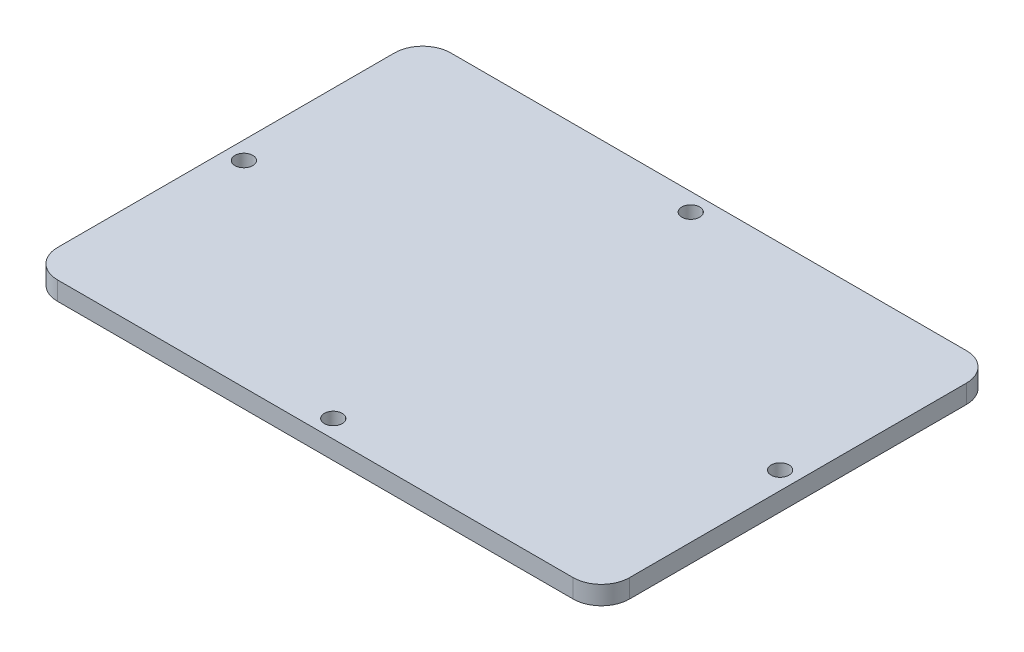
ISO-10303-21;
HEADER;
FILE_DESCRIPTION(('STEP AP214'),'2;1');
FILE_NAME('part.step','',(''),(''),'','','');
FILE_SCHEMA(('AUTOMOTIVE_DESIGN { 1 0 10303 214 1 1 1 1 }'));
ENDSEC;
DATA;
#1=APPLICATION_CONTEXT('core data for automotive mechanical design processes');
#2=APPLICATION_PROTOCOL_DEFINITION('international standard','automotive_design',2000,#1);
#3=PRODUCT_CONTEXT('',#1,'mechanical');
#4=PRODUCT('Part','Part','',(#3));
#5=PRODUCT_RELATED_PRODUCT_CATEGORY('part','',(#4));
#6=PRODUCT_DEFINITION_FORMATION('','',#4);
#7=PRODUCT_DEFINITION_CONTEXT('part definition',#1,'design');
#8=PRODUCT_DEFINITION('design','',#6,#7);
#9=PRODUCT_DEFINITION_SHAPE('','',#8);
#10=(LENGTH_UNIT() NAMED_UNIT(*) SI_UNIT(.MILLI.,.METRE.));
#11=(NAMED_UNIT(*) PLANE_ANGLE_UNIT() SI_UNIT($,.RADIAN.));
#12=(NAMED_UNIT(*) SI_UNIT($,.STERADIAN.) SOLID_ANGLE_UNIT());
#13=UNCERTAINTY_MEASURE_WITH_UNIT(LENGTH_MEASURE(1.E-05),#10,'distance_accuracy_value','');
#14=(GEOMETRIC_REPRESENTATION_CONTEXT(3) GLOBAL_UNCERTAINTY_ASSIGNED_CONTEXT((#13)) GLOBAL_UNIT_ASSIGNED_CONTEXT((#10,
#11,#12)) REPRESENTATION_CONTEXT('',''));
#15=CARTESIAN_POINT('',(0.,0.,0.));
#16=DIRECTION('',(0.,0.,1.));
#17=DIRECTION('',(1.,0.,0.));
#18=AXIS2_PLACEMENT_3D('',#15,#16,#17);
#19=CARTESIAN_POINT('',(50.8,3.302,34.925));
#20=DIRECTION('',(-1.,0.,0.));
#21=DIRECTION('',(0.,0.,1.));
#22=AXIS2_PLACEMENT_3D('',#19,#20,#21);
#23=PLANE('',#22);
#24=DIRECTION('',(0.,0.,-1.));
#25=VECTOR('',#24,1.);
#26=CARTESIAN_POINT('',(50.8,0.,34.925));
#27=LINE('',#26,#25);
#28=CARTESIAN_POINT('',(50.8,0.,29.925));
#29=VERTEX_POINT('',#28);
#30=CARTESIAN_POINT('',(50.8,0.,-29.925));
#31=VERTEX_POINT('',#30);
#32=EDGE_CURVE('E128',#29,#31,#27,.T.);
#33=ORIENTED_EDGE('',*,*,#32,.T.);
#34=DIRECTION('',(0.,-1.,0.));
#35=VECTOR('',#34,1.);
#36=CARTESIAN_POINT('',(50.8,3.302,-29.925));
#37=LINE('',#36,#35);
#38=CARTESIAN_POINT('',(50.8,3.302,-29.925));
#39=VERTEX_POINT('',#38);
#40=EDGE_CURVE('E106',#31,#39,#37,.F.);
#41=ORIENTED_EDGE('',*,*,#40,.T.);
#42=DIRECTION('',(0.,0.,-1.));
#43=VECTOR('',#42,1.);
#44=CARTESIAN_POINT('',(50.8,3.302,34.925));
#45=LINE('',#44,#43);
#46=CARTESIAN_POINT('',(50.8,3.302,29.925));
#47=VERTEX_POINT('',#46);
#48=EDGE_CURVE('E138',#47,#39,#45,.T.);
#49=ORIENTED_EDGE('',*,*,#48,.F.);
#50=DIRECTION('',(0.,-1.,0.));
#51=VECTOR('',#50,1.);
#52=CARTESIAN_POINT('',(50.8,3.302,29.925));
#53=LINE('',#52,#51);
#54=EDGE_CURVE('E111',#47,#29,#53,.T.);
#55=ORIENTED_EDGE('',*,*,#54,.T.);
#56=EDGE_LOOP('',(#33,#41,#49,#55));
#57=FACE_BOUND('',#56,.T.);
#58=ADVANCED_FACE('F35',(#57),#23,.F.);
#59=CARTESIAN_POINT('',(-50.8,3.302,-34.925));
#60=DIRECTION('',(0.,0.,1.));
#61=DIRECTION('',(1.,0.,0.));
#62=AXIS2_PLACEMENT_3D('',#59,#60,#61);
#63=PLANE('',#62);
#64=DIRECTION('',(-1.,0.,0.));
#65=VECTOR('',#64,1.);
#66=CARTESIAN_POINT('',(-50.8,3.302,-34.925));
#67=LINE('',#66,#65);
#68=CARTESIAN_POINT('',(45.8,3.302,-34.925));
#69=VERTEX_POINT('',#68);
#70=CARTESIAN_POINT('',(-45.8,3.302,-34.925));
#71=VERTEX_POINT('',#70);
#72=EDGE_CURVE('E121',#69,#71,#67,.T.);
#73=ORIENTED_EDGE('',*,*,#72,.F.);
#74=DIRECTION('',(0.,-1.,0.));
#75=VECTOR('',#74,1.);
#76=CARTESIAN_POINT('',(45.8,3.302,-34.925));
#77=LINE('',#76,#75);
#78=CARTESIAN_POINT('',(45.8,0.,-34.925));
#79=VERTEX_POINT('',#78);
#80=EDGE_CURVE('E105',#69,#79,#77,.T.);
#81=ORIENTED_EDGE('',*,*,#80,.T.);
#82=DIRECTION('',(-1.,0.,0.));
#83=VECTOR('',#82,1.);
#84=CARTESIAN_POINT('',(-50.8,0.,-34.925));
#85=LINE('',#84,#83);
#86=CARTESIAN_POINT('',(-45.8,0.,-34.925));
#87=VERTEX_POINT('',#86);
#88=EDGE_CURVE('E118',#79,#87,#85,.T.);
#89=ORIENTED_EDGE('',*,*,#88,.T.);
#90=DIRECTION('',(0.,-1.,0.));
#91=VECTOR('',#90,1.);
#92=CARTESIAN_POINT('',(-45.8,3.302,-34.925));
#93=LINE('',#92,#91);
#94=EDGE_CURVE('E123',#87,#71,#93,.F.);
#95=ORIENTED_EDGE('',*,*,#94,.T.);
#96=EDGE_LOOP('',(#73,#81,#89,#95));
#97=FACE_BOUND('',#96,.T.);
#98=ADVANCED_FACE('F117',(#97),#63,.F.);
#99=CARTESIAN_POINT('',(-50.8,3.302,34.925));
#100=DIRECTION('',(1.,0.,0.));
#101=DIRECTION('',(0.,0.,-1.));
#102=AXIS2_PLACEMENT_3D('',#99,#100,#101);
#103=PLANE('',#102);
#104=DIRECTION('',(0.,0.,1.));
#105=VECTOR('',#104,1.);
#106=CARTESIAN_POINT('',(-50.8,0.,34.925));
#107=LINE('',#106,#105);
#108=CARTESIAN_POINT('',(-50.8,0.,-29.925));
#109=VERTEX_POINT('',#108);
#110=CARTESIAN_POINT('',(-50.8,0.,29.925));
#111=VERTEX_POINT('',#110);
#112=EDGE_CURVE('E127',#109,#111,#107,.T.);
#113=ORIENTED_EDGE('',*,*,#112,.T.);
#114=DIRECTION('',(0.,-1.,0.));
#115=VECTOR('',#114,1.);
#116=CARTESIAN_POINT('',(-50.8,3.302,29.925));
#117=LINE('',#116,#115);
#118=CARTESIAN_POINT('',(-50.8,3.302,29.925));
#119=VERTEX_POINT('',#118);
#120=EDGE_CURVE('E11',#111,#119,#117,.F.);
#121=ORIENTED_EDGE('',*,*,#120,.T.);
#122=DIRECTION('',(0.,0.,1.));
#123=VECTOR('',#122,1.);
#124=CARTESIAN_POINT('',(-50.8,3.302,34.925));
#125=LINE('',#124,#123);
#126=CARTESIAN_POINT('',(-50.8,3.302,-29.925));
#127=VERTEX_POINT('',#126);
#128=EDGE_CURVE('E164',#127,#119,#125,.T.);
#129=ORIENTED_EDGE('',*,*,#128,.F.);
#130=DIRECTION('',(0.,-1.,0.));
#131=VECTOR('',#130,1.);
#132=CARTESIAN_POINT('',(-50.8,3.302,-29.925));
#133=LINE('',#132,#131);
#134=EDGE_CURVE('E43',#127,#109,#133,.T.);
#135=ORIENTED_EDGE('',*,*,#134,.T.);
#136=EDGE_LOOP('',(#113,#121,#129,#135));
#137=FACE_BOUND('',#136,.T.);
#138=ADVANCED_FACE('F162',(#137),#103,.F.);
#139=CARTESIAN_POINT('',(-50.8,3.302,34.925));
#140=DIRECTION('',(0.,0.,-1.));
#141=DIRECTION('',(-1.,0.,0.));
#142=AXIS2_PLACEMENT_3D('',#139,#140,#141);
#143=PLANE('',#142);
#144=DIRECTION('',(1.,0.,0.));
#145=VECTOR('',#144,1.);
#146=CARTESIAN_POINT('',(-50.8,0.,34.925));
#147=LINE('',#146,#145);
#148=CARTESIAN_POINT('',(-45.8,0.,34.925));
#149=VERTEX_POINT('',#148);
#150=CARTESIAN_POINT('',(45.8,0.,34.925));
#151=VERTEX_POINT('',#150);
#152=EDGE_CURVE('E131',#149,#151,#147,.T.);
#153=ORIENTED_EDGE('',*,*,#152,.T.);
#154=DIRECTION('',(0.,-1.,0.));
#155=VECTOR('',#154,1.);
#156=CARTESIAN_POINT('',(45.8,3.302,34.925));
#157=LINE('',#156,#155);
#158=CARTESIAN_POINT('',(45.8,3.302,34.925));
#159=VERTEX_POINT('',#158);
#160=EDGE_CURVE('E50',#151,#159,#157,.F.);
#161=ORIENTED_EDGE('',*,*,#160,.T.);
#162=DIRECTION('',(1.,0.,0.));
#163=VECTOR('',#162,1.);
#164=CARTESIAN_POINT('',(-50.8,3.302,34.925));
#165=LINE('',#164,#163);
#166=CARTESIAN_POINT('',(-45.8,3.302,34.925));
#167=VERTEX_POINT('',#166);
#168=EDGE_CURVE('E139',#167,#159,#165,.T.);
#169=ORIENTED_EDGE('',*,*,#168,.F.);
#170=DIRECTION('',(0.,-1.,0.));
#171=VECTOR('',#170,1.);
#172=CARTESIAN_POINT('',(-45.8,3.302,34.925));
#173=LINE('',#172,#171);
#174=EDGE_CURVE('E155',#167,#149,#173,.T.);
#175=ORIENTED_EDGE('',*,*,#174,.T.);
#176=EDGE_LOOP('',(#153,#161,#169,#175));
#177=FACE_BOUND('',#176,.T.);
#178=ADVANCED_FACE('F171',(#177),#143,.F.);
#179=CARTESIAN_POINT('',(0.,3.302,0.));
#180=DIRECTION('',(0.,-1.,0.));
#181=DIRECTION('',(0.,0.,-1.));
#182=AXIS2_PLACEMENT_3D('',#179,#180,#181);
#183=PLANE('',#182);
#184=CARTESIAN_POINT('',(0.,3.302,-31.75));
#185=DIRECTION('',(0.,-1.,0.));
#186=DIRECTION('',(0.,0.,-1.));
#187=AXIS2_PLACEMENT_3D('',#184,#185,#186);
#188=CIRCLE('',#187,1.5875);
#189=CARTESIAN_POINT('',(0.,3.302,-33.3375));
#190=VERTEX_POINT('',#189);
#191=EDGE_CURVE('E133',#190,#190,#188,.T.);
#192=ORIENTED_EDGE('',*,*,#191,.T.);
#193=EDGE_LOOP('',(#192));
#194=FACE_BOUND('',#193,.T.);
#195=CARTESIAN_POINT('',(47.625,3.302,0.));
#196=DIRECTION('',(0.,-1.,0.));
#197=DIRECTION('',(0.,0.,-1.));
#198=AXIS2_PLACEMENT_3D('',#195,#196,#197);
#199=CIRCLE('',#198,1.5875);
#200=CARTESIAN_POINT('',(47.625,3.302,-1.58749999999999));
#201=VERTEX_POINT('',#200);
#202=EDGE_CURVE('E193',#201,#201,#199,.T.);
#203=ORIENTED_EDGE('',*,*,#202,.T.);
#204=EDGE_LOOP('',(#203));
#205=FACE_BOUND('',#204,.T.);
#206=CARTESIAN_POINT('',(0.,3.302,31.75));
#207=DIRECTION('',(0.,-1.,0.));
#208=DIRECTION('',(0.,0.,-1.));
#209=AXIS2_PLACEMENT_3D('',#206,#207,#208);
#210=CIRCLE('',#209,1.5875);
#211=CARTESIAN_POINT('',(0.,3.302,30.1625));
#212=VERTEX_POINT('',#211);
#213=EDGE_CURVE('E187',#212,#212,#210,.T.);
#214=ORIENTED_EDGE('',*,*,#213,.T.);
#215=EDGE_LOOP('',(#214));
#216=FACE_BOUND('',#215,.T.);
#217=CARTESIAN_POINT('',(-47.625,3.302,0.));
#218=DIRECTION('',(0.,-1.,0.));
#219=DIRECTION('',(0.,0.,-1.));
#220=AXIS2_PLACEMENT_3D('',#217,#218,#219);
#221=CIRCLE('',#220,1.5875);
#222=CARTESIAN_POINT('',(-47.625,3.302,-1.58750000000001));
#223=VERTEX_POINT('',#222);
#224=EDGE_CURVE('E181',#223,#223,#221,.T.);
#225=ORIENTED_EDGE('',*,*,#224,.T.);
#226=EDGE_LOOP('',(#225));
#227=FACE_BOUND('',#226,.T.);
#228=ORIENTED_EDGE('',*,*,#48,.T.);
#229=CARTESIAN_POINT('',(45.8,3.302,-29.925));
#230=DIRECTION('',(0.,-1.,0.));
#231=DIRECTION('',(0.,0.,-1.));
#232=AXIS2_PLACEMENT_3D('',#229,#230,#231);
#233=CIRCLE('',#232,5.);
#234=EDGE_CURVE('E153',#39,#69,#233,.F.);
#235=ORIENTED_EDGE('',*,*,#234,.T.);
#236=ORIENTED_EDGE('',*,*,#72,.T.);
#237=CARTESIAN_POINT('',(-45.8,3.302,-29.925));
#238=DIRECTION('',(0.,-1.,0.));
#239=DIRECTION('',(0.,0.,-1.));
#240=AXIS2_PLACEMENT_3D('',#237,#238,#239);
#241=CIRCLE('',#240,5.);
#242=EDGE_CURVE('E148',#71,#127,#241,.F.);
#243=ORIENTED_EDGE('',*,*,#242,.T.);
#244=ORIENTED_EDGE('',*,*,#128,.T.);
#245=CARTESIAN_POINT('',(-45.8,3.302,29.925));
#246=DIRECTION('',(0.,-1.,0.));
#247=DIRECTION('',(0.,0.,-1.));
#248=AXIS2_PLACEMENT_3D('',#245,#246,#247);
#249=CIRCLE('',#248,5.);
#250=EDGE_CURVE('E57',#119,#167,#249,.F.);
#251=ORIENTED_EDGE('',*,*,#250,.T.);
#252=ORIENTED_EDGE('',*,*,#168,.T.);
#253=CARTESIAN_POINT('',(45.8,3.302,29.925));
#254=DIRECTION('',(0.,-1.,0.));
#255=DIRECTION('',(0.,0.,-1.));
#256=AXIS2_PLACEMENT_3D('',#253,#254,#255);
#257=CIRCLE('',#256,5.);
#258=EDGE_CURVE('E151',#159,#47,#257,.F.);
#259=ORIENTED_EDGE('',*,*,#258,.T.);
#260=EDGE_LOOP('',(#228,#235,#236,#243,#244,#251,#252,#259));
#261=FACE_BOUND('',#260,.T.);
#262=ADVANCED_FACE('F202',(#194,#205,#216,#227,#261),#183,.F.);
#263=CARTESIAN_POINT('',(0.,0.,0.));
#264=DIRECTION('',(0.,-1.,0.));
#265=DIRECTION('',(0.,0.,-1.));
#266=AXIS2_PLACEMENT_3D('',#263,#264,#265);
#267=PLANE('',#266);
#268=CARTESIAN_POINT('',(0.,0.,-31.75));
#269=DIRECTION('',(0.,-1.,0.));
#270=DIRECTION('',(0.,0.,-1.));
#271=AXIS2_PLACEMENT_3D('',#268,#269,#270);
#272=CIRCLE('',#271,1.5875);
#273=CARTESIAN_POINT('',(0.,0.,-33.3375));
#274=VERTEX_POINT('',#273);
#275=EDGE_CURVE('E196',#274,#274,#272,.T.);
#276=ORIENTED_EDGE('',*,*,#275,.F.);
#277=EDGE_LOOP('',(#276));
#278=FACE_BOUND('',#277,.T.);
#279=CARTESIAN_POINT('',(47.625,0.,0.));
#280=DIRECTION('',(0.,-1.,0.));
#281=DIRECTION('',(0.,0.,-1.));
#282=AXIS2_PLACEMENT_3D('',#279,#280,#281);
#283=CIRCLE('',#282,1.5875);
#284=CARTESIAN_POINT('',(47.625,0.,-1.58749999999999));
#285=VERTEX_POINT('',#284);
#286=EDGE_CURVE('E190',#285,#285,#283,.T.);
#287=ORIENTED_EDGE('',*,*,#286,.F.);
#288=EDGE_LOOP('',(#287));
#289=FACE_BOUND('',#288,.T.);
#290=CARTESIAN_POINT('',(0.,0.,31.75));
#291=DIRECTION('',(0.,-1.,0.));
#292=DIRECTION('',(0.,0.,-1.));
#293=AXIS2_PLACEMENT_3D('',#290,#291,#292);
#294=CIRCLE('',#293,1.5875);
#295=CARTESIAN_POINT('',(0.,0.,30.1625));
#296=VERTEX_POINT('',#295);
#297=EDGE_CURVE('E184',#296,#296,#294,.T.);
#298=ORIENTED_EDGE('',*,*,#297,.F.);
#299=EDGE_LOOP('',(#298));
#300=FACE_BOUND('',#299,.T.);
#301=CARTESIAN_POINT('',(-47.625,0.,0.));
#302=DIRECTION('',(0.,-1.,0.));
#303=DIRECTION('',(0.,0.,-1.));
#304=AXIS2_PLACEMENT_3D('',#301,#302,#303);
#305=CIRCLE('',#304,1.5875);
#306=CARTESIAN_POINT('',(-47.625,0.,-1.58750000000001));
#307=VERTEX_POINT('',#306);
#308=EDGE_CURVE('E178',#307,#307,#305,.T.);
#309=ORIENTED_EDGE('',*,*,#308,.F.);
#310=EDGE_LOOP('',(#309));
#311=FACE_BOUND('',#310,.T.);
#312=ORIENTED_EDGE('',*,*,#88,.F.);
#313=CARTESIAN_POINT('',(45.8,0.,-29.925));
#314=DIRECTION('',(0.,-1.,0.));
#315=DIRECTION('',(0.,0.,-1.));
#316=AXIS2_PLACEMENT_3D('',#313,#314,#315);
#317=CIRCLE('',#316,5.);
#318=EDGE_CURVE('E101',#79,#31,#317,.T.);
#319=ORIENTED_EDGE('',*,*,#318,.T.);
#320=ORIENTED_EDGE('',*,*,#32,.F.);
#321=CARTESIAN_POINT('',(45.8,0.,29.925));
#322=DIRECTION('',(0.,-1.,0.));
#323=DIRECTION('',(0.,0.,-1.));
#324=AXIS2_PLACEMENT_3D('',#321,#322,#323);
#325=CIRCLE('',#324,5.);
#326=EDGE_CURVE('E112',#29,#151,#325,.T.);
#327=ORIENTED_EDGE('',*,*,#326,.T.);
#328=ORIENTED_EDGE('',*,*,#152,.F.);
#329=CARTESIAN_POINT('',(-45.8,0.,29.925));
#330=DIRECTION('',(0.,-1.,0.));
#331=DIRECTION('',(0.,0.,-1.));
#332=AXIS2_PLACEMENT_3D('',#329,#330,#331);
#333=CIRCLE('',#332,5.);
#334=EDGE_CURVE('E142',#149,#111,#333,.T.);
#335=ORIENTED_EDGE('',*,*,#334,.T.);
#336=ORIENTED_EDGE('',*,*,#112,.F.);
#337=CARTESIAN_POINT('',(-45.8,0.,-29.925));
#338=DIRECTION('',(0.,-1.,0.));
#339=DIRECTION('',(0.,0.,-1.));
#340=AXIS2_PLACEMENT_3D('',#337,#338,#339);
#341=CIRCLE('',#340,5.);
#342=EDGE_CURVE('E122',#109,#87,#341,.T.);
#343=ORIENTED_EDGE('',*,*,#342,.T.);
#344=EDGE_LOOP('',(#312,#319,#320,#327,#328,#335,#336,#343));
#345=FACE_BOUND('',#344,.T.);
#346=ADVANCED_FACE('F125',(#278,#289,#300,#311,#345),#267,.T.);
#347=CARTESIAN_POINT('',(-47.625,3.302,0.));
#348=DIRECTION('',(0.,-1.,0.));
#349=DIRECTION('',(0.,0.,-1.));
#350=AXIS2_PLACEMENT_3D('',#347,#348,#349);
#351=CYLINDRICAL_SURFACE('',#350,1.5875);
#352=CARTESIAN_POINT('',(-47.625,3.302,-1.58750000000001));
#353=CARTESIAN_POINT('',(-47.625,3.26760416666667,-1.58750000000001));
#354=CARTESIAN_POINT('',(-47.625,3.23320833333333,-1.58750000000001));
#355=CARTESIAN_POINT('',(-47.625,3.16441666666667,-1.58750000000001));
#356=CARTESIAN_POINT('',(-47.625,3.13002083333333,-1.58750000000001));
#357=CARTESIAN_POINT('',(-47.625,3.06122916666667,-1.58750000000001));
#358=CARTESIAN_POINT('',(-47.625,3.02683333333333,-1.58750000000001));
#359=CARTESIAN_POINT('',(-47.625,2.95804166666667,-1.58750000000001));
#360=CARTESIAN_POINT('',(-47.625,2.92364583333333,-1.58750000000001));
#361=CARTESIAN_POINT('',(-47.625,2.85485416666667,-1.58750000000001));
#362=CARTESIAN_POINT('',(-47.625,2.82045833333333,-1.58750000000001));
#363=CARTESIAN_POINT('',(-47.625,2.75166666666667,-1.58750000000001));
#364=CARTESIAN_POINT('',(-47.625,2.71727083333333,-1.58750000000001));
#365=CARTESIAN_POINT('',(-47.625,2.64847916666667,-1.58750000000001));
#366=CARTESIAN_POINT('',(-47.625,2.61408333333333,-1.58750000000001));
#367=CARTESIAN_POINT('',(-47.625,2.54529166666667,-1.58750000000001));
#368=CARTESIAN_POINT('',(-47.625,2.51089583333333,-1.58750000000001));
#369=CARTESIAN_POINT('',(-47.625,2.44210416666667,-1.58750000000001));
#370=CARTESIAN_POINT('',(-47.625,2.40770833333333,-1.58750000000001));
#371=CARTESIAN_POINT('',(-47.625,2.33891666666667,-1.58750000000001));
#372=CARTESIAN_POINT('',(-47.625,2.30452083333333,-1.58750000000001));
#373=CARTESIAN_POINT('',(-47.625,2.23572916666667,-1.58750000000001));
#374=CARTESIAN_POINT('',(-47.625,2.20133333333333,-1.58750000000001));
#375=CARTESIAN_POINT('',(-47.625,2.13254166666667,-1.58750000000001));
#376=CARTESIAN_POINT('',(-47.625,2.09814583333333,-1.58750000000001));
#377=CARTESIAN_POINT('',(-47.625,2.02935416666667,-1.58750000000001));
#378=CARTESIAN_POINT('',(-47.625,1.99495833333333,-1.58750000000001));
#379=CARTESIAN_POINT('',(-47.625,1.92616666666667,-1.58750000000001));
#380=CARTESIAN_POINT('',(-47.625,1.89177083333333,-1.58750000000001));
#381=CARTESIAN_POINT('',(-47.625,1.82297916666667,-1.58750000000001));
#382=CARTESIAN_POINT('',(-47.625,1.78858333333333,-1.58750000000001));
#383=CARTESIAN_POINT('',(-47.625,1.71979166666667,-1.58750000000001));
#384=CARTESIAN_POINT('',(-47.625,1.68539583333333,-1.58750000000001));
#385=CARTESIAN_POINT('',(-47.625,1.61660416666667,-1.58750000000001));
#386=CARTESIAN_POINT('',(-47.625,1.58220833333333,-1.58750000000001));
#387=CARTESIAN_POINT('',(-47.625,1.51341666666667,-1.58750000000001));
#388=CARTESIAN_POINT('',(-47.625,1.47902083333333,-1.58750000000001));
#389=CARTESIAN_POINT('',(-47.625,1.41022916666667,-1.58750000000001));
#390=CARTESIAN_POINT('',(-47.625,1.37583333333333,-1.58750000000001));
#391=CARTESIAN_POINT('',(-47.625,1.30704166666667,-1.58750000000001));
#392=CARTESIAN_POINT('',(-47.625,1.27264583333333,-1.58750000000001));
#393=CARTESIAN_POINT('',(-47.625,1.20385416666667,-1.58750000000001));
#394=CARTESIAN_POINT('',(-47.625,1.16945833333333,-1.58750000000001));
#395=CARTESIAN_POINT('',(-47.625,1.10066666666667,-1.58750000000001));
#396=CARTESIAN_POINT('',(-47.625,1.06627083333333,-1.58750000000001));
#397=CARTESIAN_POINT('',(-47.625,0.997479166666667,-1.58750000000001));
#398=CARTESIAN_POINT('',(-47.625,0.963083333333334,-1.58750000000001));
#399=CARTESIAN_POINT('',(-47.625,0.894291666666667,-1.58750000000001));
#400=CARTESIAN_POINT('',(-47.625,0.859895833333333,-1.58750000000001));
#401=CARTESIAN_POINT('',(-47.625,0.791104166666666,-1.58750000000001));
#402=CARTESIAN_POINT('',(-47.625,0.756708333333333,-1.58750000000001));
#403=CARTESIAN_POINT('',(-47.625,0.687916666666667,-1.58750000000001));
#404=CARTESIAN_POINT('',(-47.625,0.653520833333333,-1.58750000000001));
#405=CARTESIAN_POINT('',(-47.625,0.584729166666667,-1.58750000000001));
#406=CARTESIAN_POINT('',(-47.625,0.550333333333333,-1.58750000000001));
#407=CARTESIAN_POINT('',(-47.625,0.481541666666667,-1.58750000000001));
#408=CARTESIAN_POINT('',(-47.625,0.447145833333333,-1.58750000000001));
#409=CARTESIAN_POINT('',(-47.625,0.378354166666667,-1.58750000000001));
#410=CARTESIAN_POINT('',(-47.625,0.343958333333333,-1.58750000000001));
#411=CARTESIAN_POINT('',(-47.625,0.275166666666667,-1.58750000000001));
#412=CARTESIAN_POINT('',(-47.625,0.240770833333333,-1.58750000000001));
#413=CARTESIAN_POINT('',(-47.625,0.171979166666667,-1.58750000000001));
#414=CARTESIAN_POINT('',(-47.625,0.137583333333333,-1.58750000000001));
#415=CARTESIAN_POINT('',(-47.625,0.0687916666666666,-1.58750000000001));
#416=CARTESIAN_POINT('',(-47.625,0.0343958333333333,-1.58750000000001));
#417=CARTESIAN_POINT('',(-47.625,0.,-1.58750000000001));
#418=B_SPLINE_CURVE_WITH_KNOTS('',3,(#352,#353,#354,#355,#356,#357,#358,#359,#360,#361,#362,
#363,#364,#365,#366,#367,#368,#369,#370,#371,#372,#373,#374,#375,#376,#377,#378,#379,#380,#381,
#382,#383,#384,#385,#386,#387,#388,#389,#390,#391,#392,#393,#394,#395,#396,#397,#398,#399,#400,
#401,#402,#403,#404,#405,#406,#407,#408,#409,#410,#411,#412,#413,#414,#415,#416,#417),
.UNSPECIFIED.,.F.,.F.,(4,2,2,2,2,2,2,2,2,2,2,2,2,2,2,2,2,2,2,2,2,2,2,2,2,2,2,2,2,2,2,2,4),(0.,
0.1031875,0.206375,0.3095625,0.41275,0.515937499999999,0.619125,0.7223125,0.8255,0.9286875,
1.031875,1.1350625,1.23825,1.3414375,1.444625,1.5478125,1.651,1.7541875,1.857375,1.9605625,
2.06375,2.1669375,2.270125,2.3733125,2.4765,2.5796875,2.682875,2.7860625,2.88925,2.9924375,
3.095625,3.1988125,3.302),.UNSPECIFIED.);
#419=EDGE_CURVE('BSEAM214',#223,#307,#418,.T.);
#420=ORIENTED_EDGE('',*,*,#224,.F.);
#421=ORIENTED_EDGE('',*,*,#308,.T.);
#422=ORIENTED_EDGE('',*,*,#419,.T.);
#423=ORIENTED_EDGE('',*,*,#419,.F.);
#424=EDGE_LOOP('',(#420,#422,#421,#423));
#425=FACE_BOUND('',#424,.T.);
#426=ADVANCED_FACE('F214',(#425),#351,.F.);
#427=CARTESIAN_POINT('',(0.,3.302,31.75));
#428=DIRECTION('',(0.,-1.,0.));
#429=DIRECTION('',(0.,0.,-1.));
#430=AXIS2_PLACEMENT_3D('',#427,#428,#429);
#431=CYLINDRICAL_SURFACE('',#430,1.5875);
#432=CARTESIAN_POINT('',(0.,3.302,30.1625));
#433=CARTESIAN_POINT('',(0.,3.26760416666667,30.1625));
#434=CARTESIAN_POINT('',(0.,3.23320833333333,30.1625));
#435=CARTESIAN_POINT('',(0.,3.16441666666667,30.1625));
#436=CARTESIAN_POINT('',(0.,3.13002083333333,30.1625));
#437=CARTESIAN_POINT('',(0.,3.06122916666667,30.1625));
#438=CARTESIAN_POINT('',(0.,3.02683333333333,30.1625));
#439=CARTESIAN_POINT('',(0.,2.95804166666667,30.1625));
#440=CARTESIAN_POINT('',(0.,2.92364583333333,30.1625));
#441=CARTESIAN_POINT('',(0.,2.85485416666667,30.1625));
#442=CARTESIAN_POINT('',(0.,2.82045833333333,30.1625));
#443=CARTESIAN_POINT('',(0.,2.75166666666667,30.1625));
#444=CARTESIAN_POINT('',(0.,2.71727083333333,30.1625));
#445=CARTESIAN_POINT('',(0.,2.64847916666667,30.1625));
#446=CARTESIAN_POINT('',(0.,2.61408333333333,30.1625));
#447=CARTESIAN_POINT('',(0.,2.54529166666667,30.1625));
#448=CARTESIAN_POINT('',(0.,2.51089583333333,30.1625));
#449=CARTESIAN_POINT('',(0.,2.44210416666667,30.1625));
#450=CARTESIAN_POINT('',(0.,2.40770833333333,30.1625));
#451=CARTESIAN_POINT('',(0.,2.33891666666667,30.1625));
#452=CARTESIAN_POINT('',(0.,2.30452083333333,30.1625));
#453=CARTESIAN_POINT('',(0.,2.23572916666667,30.1625));
#454=CARTESIAN_POINT('',(0.,2.20133333333333,30.1625));
#455=CARTESIAN_POINT('',(0.,2.13254166666667,30.1625));
#456=CARTESIAN_POINT('',(0.,2.09814583333333,30.1625));
#457=CARTESIAN_POINT('',(0.,2.02935416666667,30.1625));
#458=CARTESIAN_POINT('',(0.,1.99495833333333,30.1625));
#459=CARTESIAN_POINT('',(0.,1.92616666666667,30.1625));
#460=CARTESIAN_POINT('',(0.,1.89177083333333,30.1625));
#461=CARTESIAN_POINT('',(0.,1.82297916666667,30.1625));
#462=CARTESIAN_POINT('',(0.,1.78858333333333,30.1625));
#463=CARTESIAN_POINT('',(0.,1.71979166666667,30.1625));
#464=CARTESIAN_POINT('',(0.,1.68539583333333,30.1625));
#465=CARTESIAN_POINT('',(0.,1.61660416666667,30.1625));
#466=CARTESIAN_POINT('',(0.,1.58220833333333,30.1625));
#467=CARTESIAN_POINT('',(0.,1.51341666666667,30.1625));
#468=CARTESIAN_POINT('',(0.,1.47902083333333,30.1625));
#469=CARTESIAN_POINT('',(0.,1.41022916666667,30.1625));
#470=CARTESIAN_POINT('',(0.,1.37583333333333,30.1625));
#471=CARTESIAN_POINT('',(0.,1.30704166666667,30.1625));
#472=CARTESIAN_POINT('',(0.,1.27264583333333,30.1625));
#473=CARTESIAN_POINT('',(0.,1.20385416666667,30.1625));
#474=CARTESIAN_POINT('',(0.,1.16945833333333,30.1625));
#475=CARTESIAN_POINT('',(0.,1.10066666666667,30.1625));
#476=CARTESIAN_POINT('',(0.,1.06627083333333,30.1625));
#477=CARTESIAN_POINT('',(0.,0.997479166666667,30.1625));
#478=CARTESIAN_POINT('',(0.,0.963083333333334,30.1625));
#479=CARTESIAN_POINT('',(0.,0.894291666666667,30.1625));
#480=CARTESIAN_POINT('',(0.,0.859895833333333,30.1625));
#481=CARTESIAN_POINT('',(0.,0.791104166666666,30.1625));
#482=CARTESIAN_POINT('',(0.,0.756708333333333,30.1625));
#483=CARTESIAN_POINT('',(0.,0.687916666666667,30.1625));
#484=CARTESIAN_POINT('',(0.,0.653520833333333,30.1625));
#485=CARTESIAN_POINT('',(0.,0.584729166666667,30.1625));
#486=CARTESIAN_POINT('',(0.,0.550333333333333,30.1625));
#487=CARTESIAN_POINT('',(0.,0.481541666666667,30.1625));
#488=CARTESIAN_POINT('',(0.,0.447145833333333,30.1625));
#489=CARTESIAN_POINT('',(0.,0.378354166666667,30.1625));
#490=CARTESIAN_POINT('',(0.,0.343958333333333,30.1625));
#491=CARTESIAN_POINT('',(0.,0.275166666666667,30.1625));
#492=CARTESIAN_POINT('',(0.,0.240770833333333,30.1625));
#493=CARTESIAN_POINT('',(0.,0.171979166666667,30.1625));
#494=CARTESIAN_POINT('',(0.,0.137583333333333,30.1625));
#495=CARTESIAN_POINT('',(0.,0.0687916666666666,30.1625));
#496=CARTESIAN_POINT('',(0.,0.0343958333333333,30.1625));
#497=CARTESIAN_POINT('',(0.,0.,30.1625));
#498=B_SPLINE_CURVE_WITH_KNOTS('',3,(#432,#433,#434,#435,#436,#437,#438,#439,#440,#441,#442,
#443,#444,#445,#446,#447,#448,#449,#450,#451,#452,#453,#454,#455,#456,#457,#458,#459,#460,#461,
#462,#463,#464,#465,#466,#467,#468,#469,#470,#471,#472,#473,#474,#475,#476,#477,#478,#479,#480,
#481,#482,#483,#484,#485,#486,#487,#488,#489,#490,#491,#492,#493,#494,#495,#496,#497),
.UNSPECIFIED.,.F.,.F.,(4,2,2,2,2,2,2,2,2,2,2,2,2,2,2,2,2,2,2,2,2,2,2,2,2,2,2,2,2,2,2,2,4),(0.,
0.1031875,0.206375,0.3095625,0.41275,0.515937499999999,0.619125,0.7223125,0.8255,0.9286875,
1.031875,1.1350625,1.23825,1.3414375,1.444625,1.5478125,1.651,1.7541875,1.857375,1.9605625,
2.06375,2.1669375,2.270125,2.3733125,2.4765,2.5796875,2.682875,2.7860625,2.88925,2.9924375,
3.095625,3.1988125,3.302),.UNSPECIFIED.);
#499=EDGE_CURVE('BSEAM223',#212,#296,#498,.T.);
#500=ORIENTED_EDGE('',*,*,#213,.F.);
#501=ORIENTED_EDGE('',*,*,#297,.T.);
#502=ORIENTED_EDGE('',*,*,#499,.T.);
#503=ORIENTED_EDGE('',*,*,#499,.F.);
#504=EDGE_LOOP('',(#500,#502,#501,#503));
#505=FACE_BOUND('',#504,.T.);
#506=ADVANCED_FACE('F223',(#505),#431,.F.);
#507=CARTESIAN_POINT('',(47.625,3.302,0.));
#508=DIRECTION('',(0.,-1.,0.));
#509=DIRECTION('',(0.,0.,-1.));
#510=AXIS2_PLACEMENT_3D('',#507,#508,#509);
#511=CYLINDRICAL_SURFACE('',#510,1.5875);
#512=CARTESIAN_POINT('',(47.625,3.302,-1.58749999999999));
#513=CARTESIAN_POINT('',(47.625,3.26760416666667,-1.58749999999999));
#514=CARTESIAN_POINT('',(47.625,3.23320833333333,-1.58749999999999));
#515=CARTESIAN_POINT('',(47.625,3.16441666666667,-1.58749999999999));
#516=CARTESIAN_POINT('',(47.625,3.13002083333333,-1.58749999999999));
#517=CARTESIAN_POINT('',(47.625,3.06122916666667,-1.58749999999999));
#518=CARTESIAN_POINT('',(47.625,3.02683333333333,-1.58749999999999));
#519=CARTESIAN_POINT('',(47.625,2.95804166666667,-1.58749999999999));
#520=CARTESIAN_POINT('',(47.625,2.92364583333333,-1.58749999999999));
#521=CARTESIAN_POINT('',(47.625,2.85485416666667,-1.58749999999999));
#522=CARTESIAN_POINT('',(47.625,2.82045833333333,-1.58749999999999));
#523=CARTESIAN_POINT('',(47.625,2.75166666666667,-1.58749999999999));
#524=CARTESIAN_POINT('',(47.625,2.71727083333333,-1.58749999999999));
#525=CARTESIAN_POINT('',(47.625,2.64847916666667,-1.58749999999999));
#526=CARTESIAN_POINT('',(47.625,2.61408333333333,-1.58749999999999));
#527=CARTESIAN_POINT('',(47.625,2.54529166666667,-1.58749999999999));
#528=CARTESIAN_POINT('',(47.625,2.51089583333333,-1.58749999999999));
#529=CARTESIAN_POINT('',(47.625,2.44210416666667,-1.58749999999999));
#530=CARTESIAN_POINT('',(47.625,2.40770833333333,-1.58749999999999));
#531=CARTESIAN_POINT('',(47.625,2.33891666666667,-1.58749999999999));
#532=CARTESIAN_POINT('',(47.625,2.30452083333333,-1.58749999999999));
#533=CARTESIAN_POINT('',(47.625,2.23572916666667,-1.58749999999999));
#534=CARTESIAN_POINT('',(47.625,2.20133333333333,-1.58749999999999));
#535=CARTESIAN_POINT('',(47.625,2.13254166666667,-1.58749999999999));
#536=CARTESIAN_POINT('',(47.625,2.09814583333333,-1.58749999999999));
#537=CARTESIAN_POINT('',(47.625,2.02935416666667,-1.58749999999999));
#538=CARTESIAN_POINT('',(47.625,1.99495833333333,-1.58749999999999));
#539=CARTESIAN_POINT('',(47.625,1.92616666666667,-1.58749999999999));
#540=CARTESIAN_POINT('',(47.625,1.89177083333333,-1.58749999999999));
#541=CARTESIAN_POINT('',(47.625,1.82297916666667,-1.58749999999999));
#542=CARTESIAN_POINT('',(47.625,1.78858333333333,-1.58749999999999));
#543=CARTESIAN_POINT('',(47.625,1.71979166666667,-1.58749999999999));
#544=CARTESIAN_POINT('',(47.625,1.68539583333333,-1.58749999999999));
#545=CARTESIAN_POINT('',(47.625,1.61660416666667,-1.58749999999999));
#546=CARTESIAN_POINT('',(47.625,1.58220833333333,-1.58749999999999));
#547=CARTESIAN_POINT('',(47.625,1.51341666666667,-1.58749999999999));
#548=CARTESIAN_POINT('',(47.625,1.47902083333333,-1.58749999999999));
#549=CARTESIAN_POINT('',(47.625,1.41022916666667,-1.58749999999999));
#550=CARTESIAN_POINT('',(47.625,1.37583333333333,-1.58749999999999));
#551=CARTESIAN_POINT('',(47.625,1.30704166666667,-1.58749999999999));
#552=CARTESIAN_POINT('',(47.625,1.27264583333333,-1.58749999999999));
#553=CARTESIAN_POINT('',(47.625,1.20385416666667,-1.58749999999999));
#554=CARTESIAN_POINT('',(47.625,1.16945833333333,-1.58749999999999));
#555=CARTESIAN_POINT('',(47.625,1.10066666666667,-1.58749999999999));
#556=CARTESIAN_POINT('',(47.625,1.06627083333333,-1.58749999999999));
#557=CARTESIAN_POINT('',(47.625,0.997479166666667,-1.58749999999999));
#558=CARTESIAN_POINT('',(47.625,0.963083333333334,-1.58749999999999));
#559=CARTESIAN_POINT('',(47.625,0.894291666666667,-1.58749999999999));
#560=CARTESIAN_POINT('',(47.625,0.859895833333333,-1.58749999999999));
#561=CARTESIAN_POINT('',(47.625,0.791104166666666,-1.58749999999999));
#562=CARTESIAN_POINT('',(47.625,0.756708333333333,-1.58749999999999));
#563=CARTESIAN_POINT('',(47.625,0.687916666666667,-1.58749999999999));
#564=CARTESIAN_POINT('',(47.625,0.653520833333333,-1.58749999999999));
#565=CARTESIAN_POINT('',(47.625,0.584729166666667,-1.58749999999999));
#566=CARTESIAN_POINT('',(47.625,0.550333333333333,-1.58749999999999));
#567=CARTESIAN_POINT('',(47.625,0.481541666666667,-1.58749999999999));
#568=CARTESIAN_POINT('',(47.625,0.447145833333333,-1.58749999999999));
#569=CARTESIAN_POINT('',(47.625,0.378354166666667,-1.58749999999999));
#570=CARTESIAN_POINT('',(47.625,0.343958333333333,-1.58749999999999));
#571=CARTESIAN_POINT('',(47.625,0.275166666666667,-1.58749999999999));
#572=CARTESIAN_POINT('',(47.625,0.240770833333333,-1.58749999999999));
#573=CARTESIAN_POINT('',(47.625,0.171979166666667,-1.58749999999999));
#574=CARTESIAN_POINT('',(47.625,0.137583333333333,-1.58749999999999));
#575=CARTESIAN_POINT('',(47.625,0.0687916666666666,-1.58749999999999));
#576=CARTESIAN_POINT('',(47.625,0.0343958333333333,-1.58749999999999));
#577=CARTESIAN_POINT('',(47.625,0.,-1.58749999999999));
#578=B_SPLINE_CURVE_WITH_KNOTS('',3,(#512,#513,#514,#515,#516,#517,#518,#519,#520,#521,#522,
#523,#524,#525,#526,#527,#528,#529,#530,#531,#532,#533,#534,#535,#536,#537,#538,#539,#540,#541,
#542,#543,#544,#545,#546,#547,#548,#549,#550,#551,#552,#553,#554,#555,#556,#557,#558,#559,#560,
#561,#562,#563,#564,#565,#566,#567,#568,#569,#570,#571,#572,#573,#574,#575,#576,#577),
.UNSPECIFIED.,.F.,.F.,(4,2,2,2,2,2,2,2,2,2,2,2,2,2,2,2,2,2,2,2,2,2,2,2,2,2,2,2,2,2,2,2,4),(0.,
0.1031875,0.206375,0.3095625,0.41275,0.515937499999999,0.619125,0.7223125,0.8255,0.9286875,
1.031875,1.1350625,1.23825,1.3414375,1.444625,1.5478125,1.651,1.7541875,1.857375,1.9605625,
2.06375,2.1669375,2.270125,2.3733125,2.4765,2.5796875,2.682875,2.7860625,2.88925,2.9924375,
3.095625,3.1988125,3.302),.UNSPECIFIED.);
#579=EDGE_CURVE('BSEAM208',#201,#285,#578,.T.);
#580=ORIENTED_EDGE('',*,*,#202,.F.);
#581=ORIENTED_EDGE('',*,*,#286,.T.);
#582=ORIENTED_EDGE('',*,*,#579,.T.);
#583=ORIENTED_EDGE('',*,*,#579,.F.);
#584=EDGE_LOOP('',(#580,#582,#581,#583));
#585=FACE_BOUND('',#584,.T.);
#586=ADVANCED_FACE('F208',(#585),#511,.F.);
#587=CARTESIAN_POINT('',(0.,3.302,-31.75));
#588=DIRECTION('',(0.,-1.,0.));
#589=DIRECTION('',(0.,0.,-1.));
#590=AXIS2_PLACEMENT_3D('',#587,#588,#589);
#591=CYLINDRICAL_SURFACE('',#590,1.5875);
#592=CARTESIAN_POINT('',(0.,3.302,-33.3375));
#593=CARTESIAN_POINT('',(0.,3.26760416666667,-33.3375));
#594=CARTESIAN_POINT('',(0.,3.23320833333333,-33.3375));
#595=CARTESIAN_POINT('',(0.,3.16441666666667,-33.3375));
#596=CARTESIAN_POINT('',(0.,3.13002083333333,-33.3375));
#597=CARTESIAN_POINT('',(0.,3.06122916666667,-33.3375));
#598=CARTESIAN_POINT('',(0.,3.02683333333333,-33.3375));
#599=CARTESIAN_POINT('',(0.,2.95804166666667,-33.3375));
#600=CARTESIAN_POINT('',(0.,2.92364583333333,-33.3375));
#601=CARTESIAN_POINT('',(0.,2.85485416666667,-33.3375));
#602=CARTESIAN_POINT('',(0.,2.82045833333333,-33.3375));
#603=CARTESIAN_POINT('',(0.,2.75166666666667,-33.3375));
#604=CARTESIAN_POINT('',(0.,2.71727083333333,-33.3375));
#605=CARTESIAN_POINT('',(0.,2.64847916666667,-33.3375));
#606=CARTESIAN_POINT('',(0.,2.61408333333333,-33.3375));
#607=CARTESIAN_POINT('',(0.,2.54529166666667,-33.3375));
#608=CARTESIAN_POINT('',(0.,2.51089583333333,-33.3375));
#609=CARTESIAN_POINT('',(0.,2.44210416666667,-33.3375));
#610=CARTESIAN_POINT('',(0.,2.40770833333333,-33.3375));
#611=CARTESIAN_POINT('',(0.,2.33891666666667,-33.3375));
#612=CARTESIAN_POINT('',(0.,2.30452083333333,-33.3375));
#613=CARTESIAN_POINT('',(0.,2.23572916666667,-33.3375));
#614=CARTESIAN_POINT('',(0.,2.20133333333333,-33.3375));
#615=CARTESIAN_POINT('',(0.,2.13254166666667,-33.3375));
#616=CARTESIAN_POINT('',(0.,2.09814583333333,-33.3375));
#617=CARTESIAN_POINT('',(0.,2.02935416666667,-33.3375));
#618=CARTESIAN_POINT('',(0.,1.99495833333333,-33.3375));
#619=CARTESIAN_POINT('',(0.,1.92616666666667,-33.3375));
#620=CARTESIAN_POINT('',(0.,1.89177083333333,-33.3375));
#621=CARTESIAN_POINT('',(0.,1.82297916666667,-33.3375));
#622=CARTESIAN_POINT('',(0.,1.78858333333333,-33.3375));
#623=CARTESIAN_POINT('',(0.,1.71979166666667,-33.3375));
#624=CARTESIAN_POINT('',(0.,1.68539583333333,-33.3375));
#625=CARTESIAN_POINT('',(0.,1.61660416666667,-33.3375));
#626=CARTESIAN_POINT('',(0.,1.58220833333333,-33.3375));
#627=CARTESIAN_POINT('',(0.,1.51341666666667,-33.3375));
#628=CARTESIAN_POINT('',(0.,1.47902083333333,-33.3375));
#629=CARTESIAN_POINT('',(0.,1.41022916666667,-33.3375));
#630=CARTESIAN_POINT('',(0.,1.37583333333333,-33.3375));
#631=CARTESIAN_POINT('',(0.,1.30704166666667,-33.3375));
#632=CARTESIAN_POINT('',(0.,1.27264583333333,-33.3375));
#633=CARTESIAN_POINT('',(0.,1.20385416666667,-33.3375));
#634=CARTESIAN_POINT('',(0.,1.16945833333333,-33.3375));
#635=CARTESIAN_POINT('',(0.,1.10066666666667,-33.3375));
#636=CARTESIAN_POINT('',(0.,1.06627083333333,-33.3375));
#637=CARTESIAN_POINT('',(0.,0.997479166666667,-33.3375));
#638=CARTESIAN_POINT('',(0.,0.963083333333334,-33.3375));
#639=CARTESIAN_POINT('',(0.,0.894291666666667,-33.3375));
#640=CARTESIAN_POINT('',(0.,0.859895833333333,-33.3375));
#641=CARTESIAN_POINT('',(0.,0.791104166666666,-33.3375));
#642=CARTESIAN_POINT('',(0.,0.756708333333333,-33.3375));
#643=CARTESIAN_POINT('',(0.,0.687916666666667,-33.3375));
#644=CARTESIAN_POINT('',(0.,0.653520833333333,-33.3375));
#645=CARTESIAN_POINT('',(0.,0.584729166666667,-33.3375));
#646=CARTESIAN_POINT('',(0.,0.550333333333333,-33.3375));
#647=CARTESIAN_POINT('',(0.,0.481541666666667,-33.3375));
#648=CARTESIAN_POINT('',(0.,0.447145833333333,-33.3375));
#649=CARTESIAN_POINT('',(0.,0.378354166666667,-33.3375));
#650=CARTESIAN_POINT('',(0.,0.343958333333333,-33.3375));
#651=CARTESIAN_POINT('',(0.,0.275166666666667,-33.3375));
#652=CARTESIAN_POINT('',(0.,0.240770833333333,-33.3375));
#653=CARTESIAN_POINT('',(0.,0.171979166666667,-33.3375));
#654=CARTESIAN_POINT('',(0.,0.137583333333333,-33.3375));
#655=CARTESIAN_POINT('',(0.,0.0687916666666666,-33.3375));
#656=CARTESIAN_POINT('',(0.,0.0343958333333333,-33.3375));
#657=CARTESIAN_POINT('',(0.,0.,-33.3375));
#658=B_SPLINE_CURVE_WITH_KNOTS('',3,(#592,#593,#594,#595,#596,#597,#598,#599,#600,#601,#602,
#603,#604,#605,#606,#607,#608,#609,#610,#611,#612,#613,#614,#615,#616,#617,#618,#619,#620,#621,
#622,#623,#624,#625,#626,#627,#628,#629,#630,#631,#632,#633,#634,#635,#636,#637,#638,#639,#640,
#641,#642,#643,#644,#645,#646,#647,#648,#649,#650,#651,#652,#653,#654,#655,#656,#657),
.UNSPECIFIED.,.F.,.F.,(4,2,2,2,2,2,2,2,2,2,2,2,2,2,2,2,2,2,2,2,2,2,2,2,2,2,2,2,2,2,2,2,4),(0.,
0.1031875,0.206375,0.3095625,0.41275,0.515937499999999,0.619125,0.7223125,0.8255,0.9286875,
1.031875,1.1350625,1.23825,1.3414375,1.444625,1.5478125,1.651,1.7541875,1.857375,1.9605625,
2.06375,2.1669375,2.270125,2.3733125,2.4765,2.5796875,2.682875,2.7860625,2.88925,2.9924375,
3.095625,3.1988125,3.302),.UNSPECIFIED.);
#659=EDGE_CURVE('BSEAM205',#190,#274,#658,.T.);
#660=ORIENTED_EDGE('',*,*,#191,.F.);
#661=ORIENTED_EDGE('',*,*,#275,.T.);
#662=ORIENTED_EDGE('',*,*,#659,.T.);
#663=ORIENTED_EDGE('',*,*,#659,.F.);
#664=EDGE_LOOP('',(#660,#662,#661,#663));
#665=FACE_BOUND('',#664,.T.);
#666=ADVANCED_FACE('F205',(#665),#591,.F.);
#667=CARTESIAN_POINT('',(45.8,3.302,-29.925));
#668=DIRECTION('',(0.,-1.,0.));
#669=DIRECTION('',(0.,0.,-1.));
#670=AXIS2_PLACEMENT_3D('',#667,#668,#669);
#671=CYLINDRICAL_SURFACE('',#670,5.);
#672=ORIENTED_EDGE('',*,*,#234,.F.);
#673=ORIENTED_EDGE('',*,*,#40,.F.);
#674=ORIENTED_EDGE('',*,*,#318,.F.);
#675=ORIENTED_EDGE('',*,*,#80,.F.);
#676=EDGE_LOOP('',(#672,#673,#674,#675));
#677=FACE_BOUND('',#676,.T.);
#678=ADVANCED_FACE('F104',(#677),#671,.T.);
#679=CARTESIAN_POINT('',(45.8,3.302,29.925));
#680=DIRECTION('',(0.,-1.,0.));
#681=DIRECTION('',(0.,0.,-1.));
#682=AXIS2_PLACEMENT_3D('',#679,#680,#681);
#683=CYLINDRICAL_SURFACE('',#682,5.);
#684=ORIENTED_EDGE('',*,*,#258,.F.);
#685=ORIENTED_EDGE('',*,*,#160,.F.);
#686=ORIENTED_EDGE('',*,*,#326,.F.);
#687=ORIENTED_EDGE('',*,*,#54,.F.);
#688=EDGE_LOOP('',(#684,#685,#686,#687));
#689=FACE_BOUND('',#688,.T.);
#690=ADVANCED_FACE('F244',(#689),#683,.T.);
#691=CARTESIAN_POINT('',(-45.8,3.302,29.925));
#692=DIRECTION('',(0.,-1.,0.));
#693=DIRECTION('',(0.,0.,-1.));
#694=AXIS2_PLACEMENT_3D('',#691,#692,#693);
#695=CYLINDRICAL_SURFACE('',#694,5.);
#696=ORIENTED_EDGE('',*,*,#250,.F.);
#697=ORIENTED_EDGE('',*,*,#120,.F.);
#698=ORIENTED_EDGE('',*,*,#334,.F.);
#699=ORIENTED_EDGE('',*,*,#174,.F.);
#700=EDGE_LOOP('',(#696,#697,#698,#699));
#701=FACE_BOUND('',#700,.T.);
#702=ADVANCED_FACE('F170',(#701),#695,.T.);
#703=CARTESIAN_POINT('',(-45.8,3.302,-29.925));
#704=DIRECTION('',(0.,-1.,0.));
#705=DIRECTION('',(0.,0.,-1.));
#706=AXIS2_PLACEMENT_3D('',#703,#704,#705);
#707=CYLINDRICAL_SURFACE('',#706,5.);
#708=ORIENTED_EDGE('',*,*,#242,.F.);
#709=ORIENTED_EDGE('',*,*,#94,.F.);
#710=ORIENTED_EDGE('',*,*,#342,.F.);
#711=ORIENTED_EDGE('',*,*,#134,.F.);
#712=EDGE_LOOP('',(#708,#709,#710,#711));
#713=FACE_BOUND('',#712,.T.);
#714=ADVANCED_FACE('F37',(#713),#707,.T.);
#715=CLOSED_SHELL('',(#58,#98,#138,#178,#262,#346,#426,#506,#586,#666,#678,#690,#702,#714));
#716=MANIFOLD_SOLID_BREP('B2',#715);
#717=ADVANCED_BREP_SHAPE_REPRESENTATION('',(#18,#716),#14);
#718=SHAPE_DEFINITION_REPRESENTATION(#9,#717);
ENDSEC;
END-ISO-10303-21;
